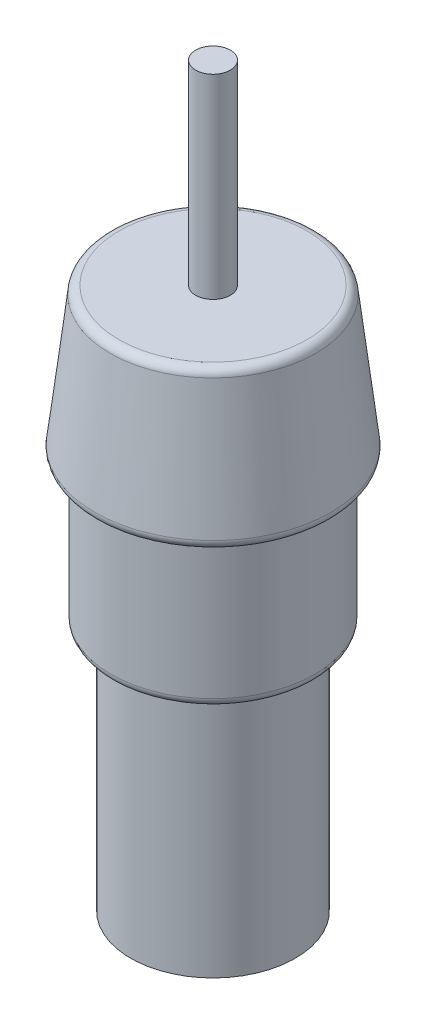
ISO-10303-21;
HEADER;
FILE_DESCRIPTION(('STEP AP214'),'2;1');
FILE_NAME('part.step','',(''),(''),'','','');
FILE_SCHEMA(('AUTOMOTIVE_DESIGN { 1 0 10303 214 1 1 1 1 }'));
ENDSEC;
DATA;
#1=APPLICATION_CONTEXT('core data for automotive mechanical design processes');
#2=APPLICATION_PROTOCOL_DEFINITION('international standard','automotive_design',2000,#1);
#3=PRODUCT_CONTEXT('',#1,'mechanical');
#4=PRODUCT('Part','Part','',(#3));
#5=PRODUCT_RELATED_PRODUCT_CATEGORY('part','',(#4));
#6=PRODUCT_DEFINITION_FORMATION('','',#4);
#7=PRODUCT_DEFINITION_CONTEXT('part definition',#1,'design');
#8=PRODUCT_DEFINITION('design','',#6,#7);
#9=PRODUCT_DEFINITION_SHAPE('','',#8);
#10=(LENGTH_UNIT() NAMED_UNIT(*) SI_UNIT(.MILLI.,.METRE.));
#11=(NAMED_UNIT(*) PLANE_ANGLE_UNIT() SI_UNIT($,.RADIAN.));
#12=(NAMED_UNIT(*) SI_UNIT($,.STERADIAN.) SOLID_ANGLE_UNIT());
#13=UNCERTAINTY_MEASURE_WITH_UNIT(LENGTH_MEASURE(1.E-05),#10,'distance_accuracy_value','');
#14=(GEOMETRIC_REPRESENTATION_CONTEXT(3) GLOBAL_UNCERTAINTY_ASSIGNED_CONTEXT((#13)) GLOBAL_UNIT_ASSIGNED_CONTEXT((#10,
#11,#12)) REPRESENTATION_CONTEXT('',''));
#15=CARTESIAN_POINT('',(0.,0.,0.));
#16=DIRECTION('',(0.,0.,1.));
#17=DIRECTION('',(1.,0.,0.));
#18=AXIS2_PLACEMENT_3D('',#15,#16,#17);
#19=CARTESIAN_POINT('',(-72.2489418291473,57.,-15.9322548609087));
#20=DIRECTION('',(0.,-1.,0.));
#21=DIRECTION('',(0.,0.,-1.));
#22=AXIS2_PLACEMENT_3D('',#19,#20,#21);
#23=CYLINDRICAL_SURFACE('',#22,19.);
#24=CARTESIAN_POINT('',(-72.2489418291473,57.,-15.9322548609087));
#25=DIRECTION('',(0.,1.,0.));
#26=DIRECTION('',(0.,0.,1.));
#27=AXIS2_PLACEMENT_3D('',#24,#25,#26);
#28=CIRCLE('',#27,19.);
#29=CARTESIAN_POINT('',(-72.2489418291473,57.,-34.9322548609087));
#30=VERTEX_POINT('',#29);
#31=EDGE_CURVE('E66',#30,#30,#28,.T.);
#32=CARTESIAN_POINT('',(-72.2489418291473,0.,-15.9322548609087));
#33=DIRECTION('',(0.,1.,0.));
#34=DIRECTION('',(0.,0.,1.));
#35=AXIS2_PLACEMENT_3D('',#32,#33,#34);
#36=CIRCLE('',#35,19.);
#37=CARTESIAN_POINT('',(-72.2489418291473,0.,-34.9322548609087));
#38=VERTEX_POINT('',#37);
#39=EDGE_CURVE('E63',#38,#38,#36,.T.);
#40=CARTESIAN_POINT('',(-72.2489418291473,57.,-34.9322548609087));
#41=CARTESIAN_POINT('',(-72.2489418291473,56.40625,-34.9322548609087));
#42=CARTESIAN_POINT('',(-72.2489418291473,55.8125,-34.9322548609087));
#43=CARTESIAN_POINT('',(-72.2489418291473,54.625,-34.9322548609087));
#44=CARTESIAN_POINT('',(-72.2489418291473,54.03125,-34.9322548609087));
#45=CARTESIAN_POINT('',(-72.2489418291473,52.84375,-34.9322548609087));
#46=CARTESIAN_POINT('',(-72.2489418291473,52.25,-34.9322548609087));
#47=CARTESIAN_POINT('',(-72.2489418291473,51.0625,-34.9322548609087));
#48=CARTESIAN_POINT('',(-72.2489418291473,50.46875,-34.9322548609087));
#49=CARTESIAN_POINT('',(-72.2489418291473,49.28125,-34.9322548609087));
#50=CARTESIAN_POINT('',(-72.2489418291473,48.6875,-34.9322548609087));
#51=CARTESIAN_POINT('',(-72.2489418291473,47.5,-34.9322548609087));
#52=CARTESIAN_POINT('',(-72.2489418291473,46.90625,-34.9322548609087));
#53=CARTESIAN_POINT('',(-72.2489418291473,45.71875,-34.9322548609087));
#54=CARTESIAN_POINT('',(-72.2489418291473,45.125,-34.9322548609087));
#55=CARTESIAN_POINT('',(-72.2489418291473,43.9375,-34.9322548609087));
#56=CARTESIAN_POINT('',(-72.2489418291473,43.34375,-34.9322548609087));
#57=CARTESIAN_POINT('',(-72.2489418291473,42.15625,-34.9322548609087));
#58=CARTESIAN_POINT('',(-72.2489418291473,41.5625,-34.9322548609087));
#59=CARTESIAN_POINT('',(-72.2489418291473,40.375,-34.9322548609087));
#60=CARTESIAN_POINT('',(-72.2489418291473,39.78125,-34.9322548609087));
#61=CARTESIAN_POINT('',(-72.2489418291473,38.59375,-34.9322548609087));
#62=CARTESIAN_POINT('',(-72.2489418291473,38.,-34.9322548609087));
#63=CARTESIAN_POINT('',(-72.2489418291473,36.8125,-34.9322548609087));
#64=CARTESIAN_POINT('',(-72.2489418291473,36.21875,-34.9322548609087));
#65=CARTESIAN_POINT('',(-72.2489418291473,35.03125,-34.9322548609087));
#66=CARTESIAN_POINT('',(-72.2489418291473,34.4375,-34.9322548609087));
#67=CARTESIAN_POINT('',(-72.2489418291473,33.25,-34.9322548609087));
#68=CARTESIAN_POINT('',(-72.2489418291473,32.65625,-34.9322548609087));
#69=CARTESIAN_POINT('',(-72.2489418291473,31.46875,-34.9322548609087));
#70=CARTESIAN_POINT('',(-72.2489418291473,30.875,-34.9322548609087));
#71=CARTESIAN_POINT('',(-72.2489418291473,29.6875,-34.9322548609087));
#72=CARTESIAN_POINT('',(-72.2489418291473,29.09375,-34.9322548609087));
#73=CARTESIAN_POINT('',(-72.2489418291473,27.90625,-34.9322548609087));
#74=CARTESIAN_POINT('',(-72.2489418291473,27.3125,-34.9322548609087));
#75=CARTESIAN_POINT('',(-72.2489418291473,26.125,-34.9322548609087));
#76=CARTESIAN_POINT('',(-72.2489418291473,25.53125,-34.9322548609087));
#77=CARTESIAN_POINT('',(-72.2489418291473,24.34375,-34.9322548609087));
#78=CARTESIAN_POINT('',(-72.2489418291473,23.75,-34.9322548609087));
#79=CARTESIAN_POINT('',(-72.2489418291473,22.5625,-34.9322548609087));
#80=CARTESIAN_POINT('',(-72.2489418291473,21.96875,-34.9322548609087));
#81=CARTESIAN_POINT('',(-72.2489418291473,20.78125,-34.9322548609087));
#82=CARTESIAN_POINT('',(-72.2489418291473,20.1875,-34.9322548609087));
#83=CARTESIAN_POINT('',(-72.2489418291473,19.,-34.9322548609087));
#84=CARTESIAN_POINT('',(-72.2489418291473,18.40625,-34.9322548609087));
#85=CARTESIAN_POINT('',(-72.2489418291473,17.21875,-34.9322548609087));
#86=CARTESIAN_POINT('',(-72.2489418291473,16.625,-34.9322548609087));
#87=CARTESIAN_POINT('',(-72.2489418291473,15.4375,-34.9322548609087));
#88=CARTESIAN_POINT('',(-72.2489418291473,14.84375,-34.9322548609087));
#89=CARTESIAN_POINT('',(-72.2489418291473,13.65625,-34.9322548609087));
#90=CARTESIAN_POINT('',(-72.2489418291473,13.0625,-34.9322548609087));
#91=CARTESIAN_POINT('',(-72.2489418291473,11.875,-34.9322548609087));
#92=CARTESIAN_POINT('',(-72.2489418291473,11.28125,-34.9322548609087));
#93=CARTESIAN_POINT('',(-72.2489418291473,10.09375,-34.9322548609087));
#94=CARTESIAN_POINT('',(-72.2489418291473,9.5,-34.9322548609087));
#95=CARTESIAN_POINT('',(-72.2489418291473,8.3125,-34.9322548609087));
#96=CARTESIAN_POINT('',(-72.2489418291473,7.71875,-34.9322548609087));
#97=CARTESIAN_POINT('',(-72.2489418291473,6.53125,-34.9322548609087));
#98=CARTESIAN_POINT('',(-72.2489418291473,5.9375,-34.9322548609087));
#99=CARTESIAN_POINT('',(-72.2489418291473,4.75,-34.9322548609087));
#100=CARTESIAN_POINT('',(-72.2489418291473,4.15625,-34.9322548609087));
#101=CARTESIAN_POINT('',(-72.2489418291473,2.96875,-34.9322548609087));
#102=CARTESIAN_POINT('',(-72.2489418291473,2.375,-34.9322548609087));
#103=CARTESIAN_POINT('',(-72.2489418291473,1.1875,-34.9322548609087));
#104=CARTESIAN_POINT('',(-72.2489418291473,0.593749999999999,-34.9322548609087));
#105=CARTESIAN_POINT('',(-72.2489418291473,0.,-34.9322548609087));
#106=B_SPLINE_CURVE_WITH_KNOTS('',3,(#40,#41,#42,#43,#44,#45,#46,#47,#48,#49,#50,#51,#52,#53,
#54,#55,#56,#57,#58,#59,#60,#61,#62,#63,#64,#65,#66,#67,#68,#69,#70,#71,#72,#73,#74,#75,#76,#77,
#78,#79,#80,#81,#82,#83,#84,#85,#86,#87,#88,#89,#90,#91,#92,#93,#94,#95,#96,#97,#98,#99,#100,
#101,#102,#103,#104,#105),.UNSPECIFIED.,.F.,.F.,(4,2,2,2,2,2,2,2,2,2,2,2,2,2,2,2,2,2,2,2,2,2,2,
2,2,2,2,2,2,2,2,2,4),(0.,1.78125000000001,3.5625,5.34375,7.12500000000001,8.90625,10.6875,
12.46875,14.25,16.03125,17.8125,19.59375,21.375,23.15625,24.9375,26.71875,28.5,30.28125,32.0625,
33.84375,35.625,37.40625,39.1875,40.96875,42.75,44.53125,46.3125,48.09375,49.875,51.65625,
53.4375,55.21875,57.),.UNSPECIFIED.);
#107=EDGE_CURVE('BSEAM36',#30,#38,#106,.T.);
#108=ORIENTED_EDGE('',*,*,#31,.F.);
#109=ORIENTED_EDGE('',*,*,#39,.T.);
#110=ORIENTED_EDGE('',*,*,#107,.T.);
#111=ORIENTED_EDGE('',*,*,#107,.F.);
#112=EDGE_LOOP('',(#108,#110,#109,#111));
#113=FACE_BOUND('',#112,.T.);
#114=ADVANCED_FACE('F36',(#113),#23,.T.);
#115=CARTESIAN_POINT('',(-72.2489418291473,0.,-15.9322548609087));
#116=DIRECTION('',(0.,1.,0.));
#117=DIRECTION('',(0.,0.,1.));
#118=AXIS2_PLACEMENT_3D('',#115,#116,#117);
#119=PLANE('',#118);
#120=ORIENTED_EDGE('',*,*,#39,.F.);
#121=EDGE_LOOP('',(#120));
#122=FACE_BOUND('',#121,.T.);
#123=ADVANCED_FACE('F102',(#122),#119,.F.);
#124=CARTESIAN_POINT('',(-72.2489418291473,91.,-15.9322548609087));
#125=DIRECTION('',(0.,-1.,0.));
#126=DIRECTION('',(0.,0.,-1.));
#127=AXIS2_PLACEMENT_3D('',#124,#125,#126);
#128=CYLINDRICAL_SURFACE('',#127,23.5);
#129=CARTESIAN_POINT('',(-72.2489418291473,59.,-15.9322548609087));
#130=DIRECTION('',(0.,1.,0.));
#131=DIRECTION('',(0.,0.,1.));
#132=AXIS2_PLACEMENT_3D('',#129,#130,#131);
#133=CIRCLE('',#132,23.5);
#134=CARTESIAN_POINT('',(-72.2489418291473,59.,7.56774513909134));
#135=VERTEX_POINT('',#134);
#136=EDGE_CURVE('E59',#135,#135,#133,.T.);
#137=ORIENTED_EDGE('',*,*,#136,.T.);
#138=EDGE_LOOP('',(#137));
#139=FACE_BOUND('',#138,.T.);
#140=CARTESIAN_POINT('',(-72.2489418291473,91.,-15.9322548609087));
#141=DIRECTION('',(0.,1.,0.));
#142=DIRECTION('',(0.,0.,1.));
#143=AXIS2_PLACEMENT_3D('',#140,#141,#142);
#144=CIRCLE('',#143,23.5);
#145=CARTESIAN_POINT('',(-72.2489418291473,91.,7.56774513909134));
#146=VERTEX_POINT('',#145);
#147=EDGE_CURVE('E67',#146,#146,#144,.T.);
#148=ORIENTED_EDGE('',*,*,#147,.F.);
#149=EDGE_LOOP('',(#148));
#150=FACE_BOUND('',#149,.T.);
#151=ADVANCED_FACE('F97',(#139,#150),#128,.T.);
#152=CARTESIAN_POINT('',(-72.2489418291473,57.,-15.9322548609087));
#153=DIRECTION('',(0.,1.,0.));
#154=DIRECTION('',(0.,0.,1.));
#155=AXIS2_PLACEMENT_3D('',#152,#153,#154);
#156=PLANE('',#155);
#157=CARTESIAN_POINT('',(-72.2489418291473,57.,-15.9322548609087));
#158=DIRECTION('',(0.,1.,0.));
#159=DIRECTION('',(0.,0.,1.));
#160=AXIS2_PLACEMENT_3D('',#157,#158,#159);
#161=CIRCLE('',#160,21.5);
#162=CARTESIAN_POINT('',(-72.2489418291473,57.,5.56774513909134));
#163=VERTEX_POINT('',#162);
#164=EDGE_CURVE('E56',#163,#163,#161,.F.);
#165=ORIENTED_EDGE('',*,*,#164,.T.);
#166=EDGE_LOOP('',(#165));
#167=FACE_BOUND('',#166,.T.);
#168=ORIENTED_EDGE('',*,*,#31,.T.);
#169=EDGE_LOOP('',(#168));
#170=FACE_BOUND('',#169,.T.);
#171=ADVANCED_FACE('F90',(#167,#170),#156,.F.);
#172=CARTESIAN_POINT('',(-72.2489418291473,125.,-15.9322548609087));
#173=DIRECTION('',(0.,1.,0.));
#174=DIRECTION('',(0.,0.,1.));
#175=AXIS2_PLACEMENT_3D('',#172,#173,#174);
#176=PLANE('',#175);
#177=CARTESIAN_POINT('',(-72.2489418291473,125.,-15.9322548609087));
#178=DIRECTION('',(0.,1.,0.));
#179=DIRECTION('',(0.,0.,1.));
#180=AXIS2_PLACEMENT_3D('',#177,#178,#179);
#181=CIRCLE('',#180,21.7215008507502);
#182=CARTESIAN_POINT('',(-72.2489418291473,125.,5.78924598984149));
#183=VERTEX_POINT('',#182);
#184=EDGE_CURVE('E11',#183,#183,#181,.T.);
#185=ORIENTED_EDGE('',*,*,#184,.T.);
#186=EDGE_LOOP('',(#185));
#187=FACE_BOUND('',#186,.T.);
#188=CARTESIAN_POINT('',(-72.2489418291473,125.,-15.9322548609087));
#189=DIRECTION('',(0.,1.,0.));
#190=DIRECTION('',(0.,0.,1.));
#191=AXIS2_PLACEMENT_3D('',#188,#189,#190);
#192=CIRCLE('',#191,4.00000000000001);
#193=CARTESIAN_POINT('',(-72.2489418291473,125.,-19.9322548609087));
#194=VERTEX_POINT('',#193);
#195=EDGE_CURVE('E62',#194,#194,#192,.T.);
#196=ORIENTED_EDGE('',*,*,#195,.F.);
#197=EDGE_LOOP('',(#196));
#198=FACE_BOUND('',#197,.T.);
#199=ADVANCED_FACE('F87',(#187,#198),#176,.T.);
#200=CARTESIAN_POINT('',(-72.2489418291473,91.,-15.9322548609087));
#201=DIRECTION('',(0.,1.,0.));
#202=DIRECTION('',(0.,0.,1.));
#203=AXIS2_PLACEMENT_3D('',#200,#201,#202);
#204=PLANE('',#203);
#205=CARTESIAN_POINT('',(-72.2489418291473,91.,-15.9322548609087));
#206=DIRECTION('',(0.,1.,0.));
#207=DIRECTION('',(0.,0.,1.));
#208=AXIS2_PLACEMENT_3D('',#205,#206,#207);
#209=CIRCLE('',#208,25.250912615456);
#210=CARTESIAN_POINT('',(-72.2489418291473,91.,9.31865775454738));
#211=VERTEX_POINT('',#210);
#212=EDGE_CURVE('E43',#211,#211,#209,.F.);
#213=ORIENTED_EDGE('',*,*,#212,.T.);
#214=EDGE_LOOP('',(#213));
#215=FACE_BOUND('',#214,.T.);
#216=ORIENTED_EDGE('',*,*,#147,.T.);
#217=EDGE_LOOP('',(#216));
#218=FACE_BOUND('',#217,.T.);
#219=ADVANCED_FACE('F89',(#215,#218),#204,.F.);
#220=CARTESIAN_POINT('',(-72.2489418291473,125.,-15.9322548609087));
#221=DIRECTION('',(0.,-1.,0.));
#222=DIRECTION('',(0.,0.,-1.));
#223=AXIS2_PLACEMENT_3D('',#220,#221,#222);
#224=CONICAL_SURFACE('',#223,23.5,0.117108744566865);
#225=CARTESIAN_POINT('',(-72.2489418291473,93.2336824951348,-15.9322548609087));
#226=DIRECTION('',(0.,-1.,0.));
#227=DIRECTION('',(0.,0.,-1.));
#228=AXIS2_PLACEMENT_3D('',#225,#226,#227);
#229=CIRCLE('',#228,27.2372138241018);
#230=CARTESIAN_POINT('',(-72.2489418291473,93.2336824951348,-43.1694686850105));
#231=VERTEX_POINT('',#230);
#232=EDGE_CURVE('E47',#231,#231,#229,.F.);
#233=ORIENTED_EDGE('',*,*,#232,.T.);
#234=EDGE_LOOP('',(#233));
#235=FACE_BOUND('',#234,.T.);
#236=CARTESIAN_POINT('',(-72.2489418291473,123.233682495135,-15.9322548609087));
#237=DIRECTION('',(0.,1.,0.));
#238=DIRECTION('',(0.,0.,1.));
#239=AXIS2_PLACEMENT_3D('',#236,#237,#238);
#240=CIRCLE('',#239,23.7078020593959);
#241=CARTESIAN_POINT('',(-72.2489418291473,123.233682495135,7.77554719848724));
#242=VERTEX_POINT('',#241);
#243=EDGE_CURVE('E51',#242,#242,#240,.F.);
#244=ORIENTED_EDGE('',*,*,#243,.T.);
#245=EDGE_LOOP('',(#244));
#246=FACE_BOUND('',#245,.T.);
#247=ADVANCED_FACE('F83',(#235,#246),#224,.T.);
#248=CARTESIAN_POINT('',(-72.2489418291473,170.,-15.9322548609087));
#249=DIRECTION('',(0.,-1.,0.));
#250=DIRECTION('',(0.,0.,-1.));
#251=AXIS2_PLACEMENT_3D('',#248,#249,#250);
#252=CYLINDRICAL_SURFACE('',#251,4.00000000000001);
#253=CARTESIAN_POINT('',(-72.2489418291473,170.,-15.9322548609087));
#254=DIRECTION('',(0.,1.,0.));
#255=DIRECTION('',(0.,0.,1.));
#256=AXIS2_PLACEMENT_3D('',#253,#254,#255);
#257=CIRCLE('',#256,4.00000000000001);
#258=CARTESIAN_POINT('',(-72.2489418291473,170.,-19.9322548609087));
#259=VERTEX_POINT('',#258);
#260=EDGE_CURVE('E72',#259,#259,#257,.T.);
#261=CARTESIAN_POINT('',(-72.2489418291473,170.,-19.9322548609087));
#262=CARTESIAN_POINT('',(-72.2489418291473,169.53125,-19.9322548609087));
#263=CARTESIAN_POINT('',(-72.2489418291473,169.0625,-19.9322548609087));
#264=CARTESIAN_POINT('',(-72.2489418291473,168.125,-19.9322548609087));
#265=CARTESIAN_POINT('',(-72.2489418291473,167.65625,-19.9322548609087));
#266=CARTESIAN_POINT('',(-72.2489418291473,166.71875,-19.9322548609087));
#267=CARTESIAN_POINT('',(-72.2489418291473,166.25,-19.9322548609087));
#268=CARTESIAN_POINT('',(-72.2489418291473,165.3125,-19.9322548609087));
#269=CARTESIAN_POINT('',(-72.2489418291473,164.84375,-19.9322548609087));
#270=CARTESIAN_POINT('',(-72.2489418291473,163.90625,-19.9322548609087));
#271=CARTESIAN_POINT('',(-72.2489418291473,163.4375,-19.9322548609087));
#272=CARTESIAN_POINT('',(-72.2489418291473,162.5,-19.9322548609087));
#273=CARTESIAN_POINT('',(-72.2489418291473,162.03125,-19.9322548609087));
#274=CARTESIAN_POINT('',(-72.2489418291473,161.09375,-19.9322548609087));
#275=CARTESIAN_POINT('',(-72.2489418291473,160.625,-19.9322548609087));
#276=CARTESIAN_POINT('',(-72.2489418291473,159.6875,-19.9322548609087));
#277=CARTESIAN_POINT('',(-72.2489418291473,159.21875,-19.9322548609087));
#278=CARTESIAN_POINT('',(-72.2489418291473,158.28125,-19.9322548609087));
#279=CARTESIAN_POINT('',(-72.2489418291473,157.8125,-19.9322548609087));
#280=CARTESIAN_POINT('',(-72.2489418291473,156.875,-19.9322548609087));
#281=CARTESIAN_POINT('',(-72.2489418291473,156.40625,-19.9322548609087));
#282=CARTESIAN_POINT('',(-72.2489418291473,155.46875,-19.9322548609087));
#283=CARTESIAN_POINT('',(-72.2489418291473,155.,-19.9322548609087));
#284=CARTESIAN_POINT('',(-72.2489418291473,154.0625,-19.9322548609087));
#285=CARTESIAN_POINT('',(-72.2489418291473,153.59375,-19.9322548609087));
#286=CARTESIAN_POINT('',(-72.2489418291473,152.65625,-19.9322548609087));
#287=CARTESIAN_POINT('',(-72.2489418291473,152.1875,-19.9322548609087));
#288=CARTESIAN_POINT('',(-72.2489418291473,151.25,-19.9322548609087));
#289=CARTESIAN_POINT('',(-72.2489418291473,150.78125,-19.9322548609087));
#290=CARTESIAN_POINT('',(-72.2489418291473,149.84375,-19.9322548609087));
#291=CARTESIAN_POINT('',(-72.2489418291473,149.375,-19.9322548609087));
#292=CARTESIAN_POINT('',(-72.2489418291473,148.4375,-19.9322548609087));
#293=CARTESIAN_POINT('',(-72.2489418291473,147.96875,-19.9322548609087));
#294=CARTESIAN_POINT('',(-72.2489418291473,147.03125,-19.9322548609087));
#295=CARTESIAN_POINT('',(-72.2489418291473,146.5625,-19.9322548609087));
#296=CARTESIAN_POINT('',(-72.2489418291473,145.625,-19.9322548609087));
#297=CARTESIAN_POINT('',(-72.2489418291473,145.15625,-19.9322548609087));
#298=CARTESIAN_POINT('',(-72.2489418291473,144.21875,-19.9322548609087));
#299=CARTESIAN_POINT('',(-72.2489418291473,143.75,-19.9322548609087));
#300=CARTESIAN_POINT('',(-72.2489418291473,142.8125,-19.9322548609087));
#301=CARTESIAN_POINT('',(-72.2489418291473,142.34375,-19.9322548609087));
#302=CARTESIAN_POINT('',(-72.2489418291473,141.40625,-19.9322548609087));
#303=CARTESIAN_POINT('',(-72.2489418291473,140.9375,-19.9322548609087));
#304=CARTESIAN_POINT('',(-72.2489418291473,140.,-19.9322548609087));
#305=CARTESIAN_POINT('',(-72.2489418291473,139.53125,-19.9322548609087));
#306=CARTESIAN_POINT('',(-72.2489418291473,138.59375,-19.9322548609087));
#307=CARTESIAN_POINT('',(-72.2489418291473,138.125,-19.9322548609087));
#308=CARTESIAN_POINT('',(-72.2489418291473,137.1875,-19.9322548609087));
#309=CARTESIAN_POINT('',(-72.2489418291473,136.71875,-19.9322548609087));
#310=CARTESIAN_POINT('',(-72.2489418291473,135.78125,-19.9322548609087));
#311=CARTESIAN_POINT('',(-72.2489418291473,135.3125,-19.9322548609087));
#312=CARTESIAN_POINT('',(-72.2489418291473,134.375,-19.9322548609087));
#313=CARTESIAN_POINT('',(-72.2489418291473,133.90625,-19.9322548609087));
#314=CARTESIAN_POINT('',(-72.2489418291473,132.96875,-19.9322548609087));
#315=CARTESIAN_POINT('',(-72.2489418291473,132.5,-19.9322548609087));
#316=CARTESIAN_POINT('',(-72.2489418291473,131.5625,-19.9322548609087));
#317=CARTESIAN_POINT('',(-72.2489418291473,131.09375,-19.9322548609087));
#318=CARTESIAN_POINT('',(-72.2489418291473,130.15625,-19.9322548609087));
#319=CARTESIAN_POINT('',(-72.2489418291473,129.6875,-19.9322548609087));
#320=CARTESIAN_POINT('',(-72.2489418291473,128.75,-19.9322548609087));
#321=CARTESIAN_POINT('',(-72.2489418291473,128.28125,-19.9322548609087));
#322=CARTESIAN_POINT('',(-72.2489418291473,127.34375,-19.9322548609087));
#323=CARTESIAN_POINT('',(-72.2489418291473,126.875,-19.9322548609087));
#324=CARTESIAN_POINT('',(-72.2489418291473,125.9375,-19.9322548609087));
#325=CARTESIAN_POINT('',(-72.2489418291473,125.46875,-19.9322548609087));
#326=CARTESIAN_POINT('',(-72.2489418291473,125.,-19.9322548609087));
#327=B_SPLINE_CURVE_WITH_KNOTS('',3,(#261,#262,#263,#264,#265,#266,#267,#268,#269,#270,#271,
#272,#273,#274,#275,#276,#277,#278,#279,#280,#281,#282,#283,#284,#285,#286,#287,#288,#289,#290,
#291,#292,#293,#294,#295,#296,#297,#298,#299,#300,#301,#302,#303,#304,#305,#306,#307,#308,#309,
#310,#311,#312,#313,#314,#315,#316,#317,#318,#319,#320,#321,#322,#323,#324,#325,#326),
.UNSPECIFIED.,.F.,.F.,(4,2,2,2,2,2,2,2,2,2,2,2,2,2,2,2,2,2,2,2,2,2,2,2,2,2,2,2,2,2,2,2,4),(0.,
1.40625000000003,2.81250000000002,4.21875000000002,5.62500000000002,7.03125000000002,
8.43750000000001,9.84375000000001,11.25,12.65625,14.0625,15.46875,16.875,18.28125,19.6875,
21.09375,22.5,23.90625,25.3125,26.71875,28.125,29.53125,30.9375,32.34375,33.75,35.15625,36.5625,
37.96875,39.375,40.78125,42.1875,43.59375,45.),.UNSPECIFIED.);
#328=EDGE_CURVE('BSEAM80',#259,#194,#327,.T.);
#329=ORIENTED_EDGE('',*,*,#260,.F.);
#330=ORIENTED_EDGE('',*,*,#195,.T.);
#331=ORIENTED_EDGE('',*,*,#328,.T.);
#332=ORIENTED_EDGE('',*,*,#328,.F.);
#333=EDGE_LOOP('',(#329,#331,#330,#332));
#334=FACE_BOUND('',#333,.T.);
#335=ADVANCED_FACE('F80',(#334),#252,.T.);
#336=CARTESIAN_POINT('',(-72.2489418291473,170.,-15.9322548609087));
#337=DIRECTION('',(0.,1.,0.));
#338=DIRECTION('',(0.,0.,1.));
#339=AXIS2_PLACEMENT_3D('',#336,#337,#338);
#340=PLANE('',#339);
#341=ORIENTED_EDGE('',*,*,#260,.T.);
#342=EDGE_LOOP('',(#341));
#343=FACE_BOUND('',#342,.T.);
#344=ADVANCED_FACE('F78',(#343),#340,.T.);
#345=CARTESIAN_POINT('',(-72.2489418291473,59.,-15.9322548609087));
#346=DIRECTION('',(0.,1.,0.));
#347=DIRECTION('',(0.,0.,1.));
#348=AXIS2_PLACEMENT_3D('',#345,#346,#347);
#349=TOROIDAL_SURFACE('',#348,21.5,2.);
#350=ORIENTED_EDGE('',*,*,#164,.F.);
#351=EDGE_LOOP('',(#350));
#352=FACE_BOUND('',#351,.T.);
#353=ORIENTED_EDGE('',*,*,#136,.F.);
#354=EDGE_LOOP('',(#353));
#355=FACE_BOUND('',#354,.T.);
#356=ADVANCED_FACE('F114',(#352,#355),#349,.T.);
#357=CARTESIAN_POINT('',(-72.2489418291473,93.,-15.9322548609087));
#358=DIRECTION('',(0.,1.,0.));
#359=DIRECTION('',(0.,0.,1.));
#360=AXIS2_PLACEMENT_3D('',#357,#358,#359);
#361=TOROIDAL_SURFACE('',#360,25.250912615456,2.);
#362=ORIENTED_EDGE('',*,*,#212,.F.);
#363=EDGE_LOOP('',(#362));
#364=FACE_BOUND('',#363,.T.);
#365=ORIENTED_EDGE('',*,*,#232,.F.);
#366=EDGE_LOOP('',(#365));
#367=FACE_BOUND('',#366,.T.);
#368=ADVANCED_FACE('F116',(#364,#367),#361,.T.);
#369=CARTESIAN_POINT('',(-72.2489418291473,123.,-15.9322548609087));
#370=DIRECTION('',(0.,1.,0.));
#371=DIRECTION('',(0.,0.,1.));
#372=AXIS2_PLACEMENT_3D('',#369,#370,#371);
#373=TOROIDAL_SURFACE('',#372,21.7215008507502,2.);
#374=ORIENTED_EDGE('',*,*,#243,.F.);
#375=EDGE_LOOP('',(#374));
#376=FACE_BOUND('',#375,.T.);
#377=ORIENTED_EDGE('',*,*,#184,.F.);
#378=EDGE_LOOP('',(#377));
#379=FACE_BOUND('',#378,.T.);
#380=ADVANCED_FACE('F38',(#376,#379),#373,.T.);
#381=CLOSED_SHELL('',(#114,#123,#151,#171,#199,#219,#247,#335,#344,#356,#368,#380));
#382=MANIFOLD_SOLID_BREP('B2',#381);
#383=ADVANCED_BREP_SHAPE_REPRESENTATION('',(#18,#382),#14);
#384=SHAPE_DEFINITION_REPRESENTATION(#9,#383);
ENDSEC;
END-ISO-10303-21;
